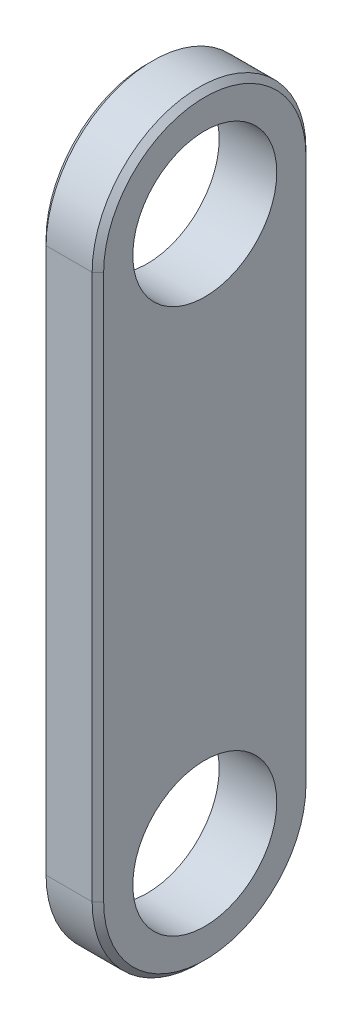
ISO-10303-21;
HEADER;
FILE_DESCRIPTION(('STEP AP214'),'2;1');
FILE_NAME('part.step','',(''),(''),'','','');
FILE_SCHEMA(('AUTOMOTIVE_DESIGN { 1 0 10303 214 1 1 1 1 }'));
ENDSEC;
DATA;
#1=APPLICATION_CONTEXT('core data for automotive mechanical design processes');
#2=APPLICATION_PROTOCOL_DEFINITION('international standard','automotive_design',2000,#1);
#3=PRODUCT_CONTEXT('',#1,'mechanical');
#4=PRODUCT('Part','Part','',(#3));
#5=PRODUCT_RELATED_PRODUCT_CATEGORY('part','',(#4));
#6=PRODUCT_DEFINITION_FORMATION('','',#4);
#7=PRODUCT_DEFINITION_CONTEXT('part definition',#1,'design');
#8=PRODUCT_DEFINITION('design','',#6,#7);
#9=PRODUCT_DEFINITION_SHAPE('','',#8);
#10=(LENGTH_UNIT() NAMED_UNIT(*) SI_UNIT(.MILLI.,.METRE.));
#11=(NAMED_UNIT(*) PLANE_ANGLE_UNIT() SI_UNIT($,.RADIAN.));
#12=(NAMED_UNIT(*) SI_UNIT($,.STERADIAN.) SOLID_ANGLE_UNIT());
#13=UNCERTAINTY_MEASURE_WITH_UNIT(LENGTH_MEASURE(1.E-05),#10,'distance_accuracy_value','');
#14=(GEOMETRIC_REPRESENTATION_CONTEXT(3) GLOBAL_UNCERTAINTY_ASSIGNED_CONTEXT((#13)) GLOBAL_UNIT_ASSIGNED_CONTEXT((#10,
#11,#12)) REPRESENTATION_CONTEXT('',''));
#15=CARTESIAN_POINT('',(0.,0.,0.));
#16=DIRECTION('',(0.,0.,1.));
#17=DIRECTION('',(1.,0.,0.));
#18=AXIS2_PLACEMENT_3D('',#15,#16,#17);
#19=CARTESIAN_POINT('',(10.,94.6778689834595,0.));
#20=DIRECTION('',(1.,0.,0.));
#21=DIRECTION('',(0.,0.,-1.));
#22=AXIS2_PLACEMENT_3D('',#19,#20,#21);
#23=PLANE('',#22);
#24=CARTESIAN_POINT('',(10.,-94.6778689834595,0.));
#25=DIRECTION('',(1.,0.,0.));
#26=DIRECTION('',(0.,0.,-1.));
#27=AXIS2_PLACEMENT_3D('',#24,#25,#26);
#28=CIRCLE('',#27,35.1285760719449);
#29=CARTESIAN_POINT('',(10.,-94.6778689834595,35.1285760719449));
#30=VERTEX_POINT('',#29);
#31=CARTESIAN_POINT('',(10.,-94.6778689834595,-35.1285760719449));
#32=VERTEX_POINT('',#31);
#33=EDGE_CURVE('E66',#30,#32,#28,.T.);
#34=ORIENTED_EDGE('',*,*,#33,.T.);
#35=DIRECTION('',(0.,1.,0.));
#36=VECTOR('',#35,1.);
#37=CARTESIAN_POINT('',(10.,94.6778689834596,-35.1285760719449));
#38=LINE('',#37,#36);
#39=CARTESIAN_POINT('',(10.,94.6778689834596,-35.1285760719449));
#40=VERTEX_POINT('',#39);
#41=EDGE_CURVE('E11',#32,#40,#38,.T.);
#42=ORIENTED_EDGE('',*,*,#41,.T.);
#43=CARTESIAN_POINT('',(10.,94.6778689834595,0.));
#44=DIRECTION('',(1.,0.,0.));
#45=DIRECTION('',(0.,0.,-1.));
#46=AXIS2_PLACEMENT_3D('',#43,#44,#45);
#47=CIRCLE('',#46,35.1285760719449);
#48=CARTESIAN_POINT('',(10.,94.6778689834595,35.1285760719449));
#49=VERTEX_POINT('',#48);
#50=EDGE_CURVE('E51',#40,#49,#47,.T.);
#51=ORIENTED_EDGE('',*,*,#50,.T.);
#52=DIRECTION('',(0.,-1.,0.));
#53=VECTOR('',#52,1.);
#54=CARTESIAN_POINT('',(10.,-94.6778689834595,35.1285760719449));
#55=LINE('',#54,#53);
#56=EDGE_CURVE('E206',#49,#30,#55,.T.);
#57=ORIENTED_EDGE('',*,*,#56,.T.);
#58=EDGE_LOOP('',(#34,#42,#51,#57));
#59=FACE_BOUND('',#58,.T.);
#60=CARTESIAN_POINT('',(10.,-94.6778689834595,0.));
#61=DIRECTION('',(1.,0.,0.));
#62=DIRECTION('',(0.,0.,-1.));
#63=AXIS2_PLACEMENT_3D('',#60,#61,#62);
#64=CIRCLE('',#63,25.);
#65=CARTESIAN_POINT('',(10.,-94.6778689834595,-25.));
#66=VERTEX_POINT('',#65);
#67=EDGE_CURVE('E134',#66,#66,#64,.T.);
#68=ORIENTED_EDGE('',*,*,#67,.F.);
#69=EDGE_LOOP('',(#68));
#70=FACE_BOUND('',#69,.T.);
#71=CARTESIAN_POINT('',(10.,94.6778689834595,0.));
#72=DIRECTION('',(1.,0.,0.));
#73=DIRECTION('',(0.,0.,-1.));
#74=AXIS2_PLACEMENT_3D('',#71,#72,#73);
#75=CIRCLE('',#74,25.);
#76=CARTESIAN_POINT('',(10.,94.6778689834595,-25.));
#77=VERTEX_POINT('',#76);
#78=EDGE_CURVE('E171',#77,#77,#75,.T.);
#79=ORIENTED_EDGE('',*,*,#78,.F.);
#80=EDGE_LOOP('',(#79));
#81=FACE_BOUND('',#80,.T.);
#82=ADVANCED_FACE('F41',(#59,#70,#81),#23,.T.);
#83=CARTESIAN_POINT('',(-10.,94.6778689834595,0.));
#84=DIRECTION('',(1.,0.,0.));
#85=DIRECTION('',(0.,0.,-1.));
#86=AXIS2_PLACEMENT_3D('',#83,#84,#85);
#87=PLANE('',#86);
#88=CARTESIAN_POINT('',(-10.,94.6778689834595,0.));
#89=DIRECTION('',(1.,0.,0.));
#90=DIRECTION('',(0.,0.,-1.));
#91=AXIS2_PLACEMENT_3D('',#88,#89,#90);
#92=CIRCLE('',#91,35.1285760719449);
#93=CARTESIAN_POINT('',(-10.,94.6778689834595,35.1285760719449));
#94=VERTEX_POINT('',#93);
#95=CARTESIAN_POINT('',(-10.,94.6778689834596,-35.1285760719448));
#96=VERTEX_POINT('',#95);
#97=EDGE_CURVE('E193',#94,#96,#92,.F.);
#98=ORIENTED_EDGE('',*,*,#97,.T.);
#99=DIRECTION('',(0.,-1.,0.));
#100=VECTOR('',#99,1.);
#101=CARTESIAN_POINT('',(-10.,94.6778689834596,-35.1285760719448));
#102=LINE('',#101,#100);
#103=CARTESIAN_POINT('',(-10.,-94.6778689834595,-35.1285760719449));
#104=VERTEX_POINT('',#103);
#105=EDGE_CURVE('E122',#96,#104,#102,.T.);
#106=ORIENTED_EDGE('',*,*,#105,.T.);
#107=CARTESIAN_POINT('',(-10.,-94.6778689834595,0.));
#108=DIRECTION('',(1.,0.,0.));
#109=DIRECTION('',(0.,0.,-1.));
#110=AXIS2_PLACEMENT_3D('',#107,#108,#109);
#111=CIRCLE('',#110,35.1285760719449);
#112=CARTESIAN_POINT('',(-10.,-94.6778689834595,35.1285760719449));
#113=VERTEX_POINT('',#112);
#114=EDGE_CURVE('E191',#104,#113,#111,.F.);
#115=ORIENTED_EDGE('',*,*,#114,.T.);
#116=DIRECTION('',(0.,1.,0.));
#117=VECTOR('',#116,1.);
#118=CARTESIAN_POINT('',(-10.,94.6778689834595,35.1285760719449));
#119=LINE('',#118,#117);
#120=EDGE_CURVE('E189',#113,#94,#119,.T.);
#121=ORIENTED_EDGE('',*,*,#120,.T.);
#122=EDGE_LOOP('',(#98,#106,#115,#121));
#123=FACE_BOUND('',#122,.T.);
#124=CARTESIAN_POINT('',(-10.,-94.6778689834595,0.));
#125=DIRECTION('',(1.,0.,0.));
#126=DIRECTION('',(0.,0.,-1.));
#127=AXIS2_PLACEMENT_3D('',#124,#125,#126);
#128=CIRCLE('',#127,25.);
#129=CARTESIAN_POINT('',(-10.,-94.6778689834595,-25.));
#130=VERTEX_POINT('',#129);
#131=EDGE_CURVE('E176',#130,#130,#128,.T.);
#132=ORIENTED_EDGE('',*,*,#131,.T.);
#133=EDGE_LOOP('',(#132));
#134=FACE_BOUND('',#133,.T.);
#135=CARTESIAN_POINT('',(-10.,94.6778689834595,0.));
#136=DIRECTION('',(1.,0.,0.));
#137=DIRECTION('',(0.,0.,-1.));
#138=AXIS2_PLACEMENT_3D('',#135,#136,#137);
#139=CIRCLE('',#138,25.);
#140=CARTESIAN_POINT('',(-10.,94.6778689834595,-25.));
#141=VERTEX_POINT('',#140);
#142=EDGE_CURVE('E165',#141,#141,#139,.T.);
#143=ORIENTED_EDGE('',*,*,#142,.T.);
#144=EDGE_LOOP('',(#143));
#145=FACE_BOUND('',#144,.T.);
#146=ADVANCED_FACE('F236',(#123,#134,#145),#87,.F.);
#147=CARTESIAN_POINT('',(10.,94.6778689834595,0.));
#148=DIRECTION('',(-1.,0.,0.));
#149=DIRECTION('',(0.,0.,1.));
#150=AXIS2_PLACEMENT_3D('',#147,#148,#149);
#151=CYLINDRICAL_SURFACE('',#150,37.1285760719449);
#152=DIRECTION('',(-1.,0.,0.));
#153=VECTOR('',#152,1.);
#154=CARTESIAN_POINT('',(10.,94.6778689834596,-37.1285760719449));
#155=LINE('',#154,#153);
#156=CARTESIAN_POINT('',(8.,94.6778689834596,-37.1285760719449));
#157=VERTEX_POINT('',#156);
#158=CARTESIAN_POINT('',(-7.99999999999997,94.6778689834596,-37.1285760719449));
#159=VERTEX_POINT('',#158);
#160=EDGE_CURVE('E115',#157,#159,#155,.T.);
#161=ORIENTED_EDGE('',*,*,#160,.T.);
#162=CARTESIAN_POINT('',(-7.99999999999997,94.6778689834595,0.));
#163=DIRECTION('',(1.,0.,0.));
#164=DIRECTION('',(0.,0.,-1.));
#165=AXIS2_PLACEMENT_3D('',#162,#163,#164);
#166=CIRCLE('',#165,37.1285760719449);
#167=CARTESIAN_POINT('',(-7.99999999999997,94.6778689834595,37.128576071945));
#168=VERTEX_POINT('',#167);
#169=EDGE_CURVE('E121',#159,#168,#166,.T.);
#170=ORIENTED_EDGE('',*,*,#169,.T.);
#171=DIRECTION('',(-1.,0.,0.));
#172=VECTOR('',#171,1.);
#173=CARTESIAN_POINT('',(10.,94.6778689834595,37.128576071945));
#174=LINE('',#173,#172);
#175=CARTESIAN_POINT('',(8.,94.6778689834595,37.128576071945));
#176=VERTEX_POINT('',#175);
#177=EDGE_CURVE('E117',#176,#168,#174,.T.);
#178=ORIENTED_EDGE('',*,*,#177,.F.);
#179=CARTESIAN_POINT('',(8.,94.6778689834595,0.));
#180=DIRECTION('',(1.,0.,0.));
#181=DIRECTION('',(0.,0.,-1.));
#182=AXIS2_PLACEMENT_3D('',#179,#180,#181);
#183=CIRCLE('',#182,37.1285760719449);
#184=EDGE_CURVE('E112',#176,#157,#183,.F.);
#185=ORIENTED_EDGE('',*,*,#184,.T.);
#186=EDGE_LOOP('',(#161,#170,#178,#185));
#187=FACE_BOUND('',#186,.T.);
#188=ADVANCED_FACE('F114',(#187),#151,.T.);
#189=CARTESIAN_POINT('',(10.,94.6778689834595,37.128576071945));
#190=DIRECTION('',(0.,0.,-1.));
#191=DIRECTION('',(0.,1.,0.));
#192=AXIS2_PLACEMENT_3D('',#189,#190,#191);
#193=PLANE('',#192);
#194=ORIENTED_EDGE('',*,*,#177,.T.);
#195=DIRECTION('',(0.,-1.,0.));
#196=VECTOR('',#195,1.);
#197=CARTESIAN_POINT('',(-7.99999999999997,94.6778689834595,37.128576071945));
#198=LINE('',#197,#196);
#199=CARTESIAN_POINT('',(-7.99999999999997,-94.6778689834595,37.1285760719449));
#200=VERTEX_POINT('',#199);
#201=EDGE_CURVE('E204',#168,#200,#198,.T.);
#202=ORIENTED_EDGE('',*,*,#201,.T.);
#203=DIRECTION('',(-1.,0.,0.));
#204=VECTOR('',#203,1.);
#205=CARTESIAN_POINT('',(10.,-94.6778689834595,37.1285760719449));
#206=LINE('',#205,#204);
#207=CARTESIAN_POINT('',(8.,-94.6778689834595,37.1285760719449));
#208=VERTEX_POINT('',#207);
#209=EDGE_CURVE('E184',#208,#200,#206,.T.);
#210=ORIENTED_EDGE('',*,*,#209,.F.);
#211=DIRECTION('',(0.,1.,0.));
#212=VECTOR('',#211,1.);
#213=CARTESIAN_POINT('',(8.,94.6778689834595,37.128576071945));
#214=LINE('',#213,#212);
#215=EDGE_CURVE('E202',#208,#176,#214,.T.);
#216=ORIENTED_EDGE('',*,*,#215,.T.);
#217=EDGE_LOOP('',(#194,#202,#210,#216));
#218=FACE_BOUND('',#217,.T.);
#219=ADVANCED_FACE('F217',(#218),#193,.F.);
#220=CARTESIAN_POINT('',(10.,-94.6778689834595,0.));
#221=DIRECTION('',(-1.,0.,0.));
#222=DIRECTION('',(0.,0.,1.));
#223=AXIS2_PLACEMENT_3D('',#220,#221,#222);
#224=CYLINDRICAL_SURFACE('',#223,37.1285760719449);
#225=ORIENTED_EDGE('',*,*,#209,.T.);
#226=CARTESIAN_POINT('',(-7.99999999999997,-94.6778689834595,0.));
#227=DIRECTION('',(1.,0.,0.));
#228=DIRECTION('',(0.,0.,-1.));
#229=AXIS2_PLACEMENT_3D('',#226,#227,#228);
#230=CIRCLE('',#229,37.1285760719449);
#231=CARTESIAN_POINT('',(-7.99999999999997,-94.6778689834595,-37.1285760719449));
#232=VERTEX_POINT('',#231);
#233=EDGE_CURVE('E200',#200,#232,#230,.T.);
#234=ORIENTED_EDGE('',*,*,#233,.T.);
#235=DIRECTION('',(-1.,0.,0.));
#236=VECTOR('',#235,1.);
#237=CARTESIAN_POINT('',(10.,-94.6778689834595,-37.1285760719449));
#238=LINE('',#237,#236);
#239=CARTESIAN_POINT('',(8.,-94.6778689834595,-37.1285760719449));
#240=VERTEX_POINT('',#239);
#241=EDGE_CURVE('E133',#240,#232,#238,.T.);
#242=ORIENTED_EDGE('',*,*,#241,.F.);
#243=CARTESIAN_POINT('',(8.,-94.6778689834595,0.));
#244=DIRECTION('',(1.,0.,0.));
#245=DIRECTION('',(0.,0.,-1.));
#246=AXIS2_PLACEMENT_3D('',#243,#244,#245);
#247=CIRCLE('',#246,37.1285760719449);
#248=EDGE_CURVE('E198',#240,#208,#247,.F.);
#249=ORIENTED_EDGE('',*,*,#248,.T.);
#250=EDGE_LOOP('',(#225,#234,#242,#249));
#251=FACE_BOUND('',#250,.T.);
#252=ADVANCED_FACE('F215',(#251),#224,.T.);
#253=CARTESIAN_POINT('',(10.,94.6778689834596,-37.1285760719449));
#254=DIRECTION('',(0.,0.,1.));
#255=DIRECTION('',(0.,-1.,0.));
#256=AXIS2_PLACEMENT_3D('',#253,#254,#255);
#257=PLANE('',#256);
#258=ORIENTED_EDGE('',*,*,#241,.T.);
#259=DIRECTION('',(0.,1.,0.));
#260=VECTOR('',#259,1.);
#261=CARTESIAN_POINT('',(-7.99999999999997,94.6778689834596,-37.1285760719449));
#262=LINE('',#261,#260);
#263=EDGE_CURVE('E132',#232,#159,#262,.T.);
#264=ORIENTED_EDGE('',*,*,#263,.T.);
#265=ORIENTED_EDGE('',*,*,#160,.F.);
#266=DIRECTION('',(0.,-1.,0.));
#267=VECTOR('',#266,1.);
#268=CARTESIAN_POINT('',(8.,-94.6778689834595,-37.1285760719449));
#269=LINE('',#268,#267);
#270=EDGE_CURVE('E129',#157,#240,#269,.T.);
#271=ORIENTED_EDGE('',*,*,#270,.T.);
#272=EDGE_LOOP('',(#258,#264,#265,#271));
#273=FACE_BOUND('',#272,.T.);
#274=ADVANCED_FACE('F128',(#273),#257,.F.);
#275=CARTESIAN_POINT('',(10.,-94.6778689834595,0.));
#276=DIRECTION('',(-1.,0.,0.));
#277=DIRECTION('',(0.,0.,1.));
#278=AXIS2_PLACEMENT_3D('',#275,#276,#277);
#279=CYLINDRICAL_SURFACE('',#278,25.);
#280=ORIENTED_EDGE('',*,*,#67,.T.);
#281=EDGE_LOOP('',(#280));
#282=FACE_BOUND('',#281,.T.);
#283=ORIENTED_EDGE('',*,*,#131,.F.);
#284=EDGE_LOOP('',(#283));
#285=FACE_BOUND('',#284,.T.);
#286=ADVANCED_FACE('F245',(#282,#285),#279,.F.);
#287=CARTESIAN_POINT('',(10.,94.6778689834595,0.));
#288=DIRECTION('',(-1.,0.,0.));
#289=DIRECTION('',(0.,0.,1.));
#290=AXIS2_PLACEMENT_3D('',#287,#288,#289);
#291=CYLINDRICAL_SURFACE('',#290,25.);
#292=ORIENTED_EDGE('',*,*,#78,.T.);
#293=EDGE_LOOP('',(#292));
#294=FACE_BOUND('',#293,.T.);
#295=ORIENTED_EDGE('',*,*,#142,.F.);
#296=EDGE_LOOP('',(#295));
#297=FACE_BOUND('',#296,.T.);
#298=ADVANCED_FACE('F281',(#294,#297),#291,.F.);
#299=CARTESIAN_POINT('',(-7.99999999999997,94.6778689834595,37.128576071945));
#300=DIRECTION('',(0.707106781186547,0.,-0.707106781186547));
#301=DIRECTION('',(0.,-1.,0.));
#302=AXIS2_PLACEMENT_3D('',#299,#300,#301);
#303=PLANE('',#302);
#304=DIRECTION('',(0.707106781186547,0.,0.707106781186547));
#305=VECTOR('',#304,1.);
#306=CARTESIAN_POINT('',(-10.,94.6778689834595,35.1285760719449));
#307=LINE('',#306,#305);
#308=EDGE_CURVE('E157',#94,#168,#307,.T.);
#309=ORIENTED_EDGE('',*,*,#308,.F.);
#310=ORIENTED_EDGE('',*,*,#120,.F.);
#311=DIRECTION('',(-0.707106781186547,0.,-0.707106781186547));
#312=VECTOR('',#311,1.);
#313=CARTESIAN_POINT('',(-7.99999999999997,-94.6778689834595,37.1285760719449));
#314=LINE('',#313,#312);
#315=EDGE_CURVE('E145',#200,#113,#314,.T.);
#316=ORIENTED_EDGE('',*,*,#315,.F.);
#317=ORIENTED_EDGE('',*,*,#201,.F.);
#318=EDGE_LOOP('',(#309,#310,#316,#317));
#319=FACE_BOUND('',#318,.T.);
#320=ADVANCED_FACE('F220',(#319),#303,.F.);
#321=CARTESIAN_POINT('',(-7.99999999999997,-94.6778689834595,0.));
#322=DIRECTION('',(1.,0.,0.));
#323=DIRECTION('',(0.,0.,-1.));
#324=AXIS2_PLACEMENT_3D('',#321,#322,#323);
#325=CONICAL_SURFACE('',#324,37.1285760719449,0.785398163397448);
#326=ORIENTED_EDGE('',*,*,#315,.T.);
#327=ORIENTED_EDGE('',*,*,#114,.F.);
#328=DIRECTION('',(-0.707106781186547,0.,0.707106781186547));
#329=VECTOR('',#328,1.);
#330=CARTESIAN_POINT('',(-7.99999999999997,-94.6778689834595,-37.1285760719449));
#331=LINE('',#330,#329);
#332=EDGE_CURVE('E151',#232,#104,#331,.T.);
#333=ORIENTED_EDGE('',*,*,#332,.F.);
#334=ORIENTED_EDGE('',*,*,#233,.F.);
#335=EDGE_LOOP('',(#326,#327,#333,#334));
#336=FACE_BOUND('',#335,.T.);
#337=ADVANCED_FACE('F223',(#336),#325,.T.);
#338=CARTESIAN_POINT('',(-7.99999999999997,94.6778689834595,0.));
#339=DIRECTION('',(1.,0.,0.));
#340=DIRECTION('',(0.,0.,-1.));
#341=AXIS2_PLACEMENT_3D('',#338,#339,#340);
#342=CONICAL_SURFACE('',#341,37.1285760719449,0.785398163397448);
#343=ORIENTED_EDGE('',*,*,#308,.T.);
#344=ORIENTED_EDGE('',*,*,#169,.F.);
#345=DIRECTION('',(0.707106781186547,0.,-0.707106781186547));
#346=VECTOR('',#345,1.);
#347=CARTESIAN_POINT('',(-10.,94.6778689834596,-35.1285760719448));
#348=LINE('',#347,#346);
#349=EDGE_CURVE('E148',#96,#159,#348,.T.);
#350=ORIENTED_EDGE('',*,*,#349,.F.);
#351=ORIENTED_EDGE('',*,*,#97,.F.);
#352=EDGE_LOOP('',(#343,#344,#350,#351));
#353=FACE_BOUND('',#352,.T.);
#354=ADVANCED_FACE('F226',(#353),#342,.T.);
#355=CARTESIAN_POINT('',(-7.99999999999997,94.6778689834596,-37.1285760719449));
#356=DIRECTION('',(0.707106781186547,0.,0.707106781186547));
#357=DIRECTION('',(0.,1.,0.));
#358=AXIS2_PLACEMENT_3D('',#355,#356,#357);
#359=PLANE('',#358);
#360=ORIENTED_EDGE('',*,*,#332,.T.);
#361=ORIENTED_EDGE('',*,*,#105,.F.);
#362=ORIENTED_EDGE('',*,*,#349,.T.);
#363=ORIENTED_EDGE('',*,*,#263,.F.);
#364=EDGE_LOOP('',(#360,#361,#362,#363));
#365=FACE_BOUND('',#364,.T.);
#366=ADVANCED_FACE('F224',(#365),#359,.F.);
#367=CARTESIAN_POINT('',(10.,94.6778689834595,35.1285760719449));
#368=DIRECTION('',(0.707106781186547,0.,0.707106781186547));
#369=DIRECTION('',(0.,1.,0.));
#370=AXIS2_PLACEMENT_3D('',#367,#368,#369);
#371=PLANE('',#370);
#372=DIRECTION('',(0.707106781186547,0.,-0.707106781186547));
#373=VECTOR('',#372,1.);
#374=CARTESIAN_POINT('',(8.,94.6778689834595,37.128576071945));
#375=LINE('',#374,#373);
#376=EDGE_CURVE('E142',#176,#49,#375,.T.);
#377=ORIENTED_EDGE('',*,*,#376,.F.);
#378=ORIENTED_EDGE('',*,*,#215,.F.);
#379=DIRECTION('',(-0.707106781186547,0.,0.707106781186547));
#380=VECTOR('',#379,1.);
#381=CARTESIAN_POINT('',(10.,-94.6778689834595,35.1285760719449));
#382=LINE('',#381,#380);
#383=EDGE_CURVE('E46',#30,#208,#382,.T.);
#384=ORIENTED_EDGE('',*,*,#383,.F.);
#385=ORIENTED_EDGE('',*,*,#56,.F.);
#386=EDGE_LOOP('',(#377,#378,#384,#385));
#387=FACE_BOUND('',#386,.T.);
#388=ADVANCED_FACE('F44',(#387),#371,.T.);
#389=CARTESIAN_POINT('',(10.,-94.6778689834595,0.));
#390=DIRECTION('',(-1.,0.,0.));
#391=DIRECTION('',(0.,0.,1.));
#392=AXIS2_PLACEMENT_3D('',#389,#390,#391);
#393=CONICAL_SURFACE('',#392,35.1285760719449,0.785398163397448);
#394=ORIENTED_EDGE('',*,*,#383,.T.);
#395=ORIENTED_EDGE('',*,*,#248,.F.);
#396=DIRECTION('',(-0.707106781186547,0.,-0.707106781186547));
#397=VECTOR('',#396,1.);
#398=CARTESIAN_POINT('',(10.,-94.6778689834595,-35.1285760719449));
#399=LINE('',#398,#397);
#400=EDGE_CURVE('E137',#32,#240,#399,.T.);
#401=ORIENTED_EDGE('',*,*,#400,.F.);
#402=ORIENTED_EDGE('',*,*,#33,.F.);
#403=EDGE_LOOP('',(#394,#395,#401,#402));
#404=FACE_BOUND('',#403,.T.);
#405=ADVANCED_FACE('F212',(#404),#393,.T.);
#406=CARTESIAN_POINT('',(10.,94.6778689834595,0.));
#407=DIRECTION('',(-1.,0.,0.));
#408=DIRECTION('',(0.,0.,1.));
#409=AXIS2_PLACEMENT_3D('',#406,#407,#408);
#410=CONICAL_SURFACE('',#409,35.1285760719449,0.785398163397448);
#411=ORIENTED_EDGE('',*,*,#376,.T.);
#412=ORIENTED_EDGE('',*,*,#50,.F.);
#413=DIRECTION('',(0.707106781186547,0.,0.707106781186547));
#414=VECTOR('',#413,1.);
#415=CARTESIAN_POINT('',(8.,94.6778689834596,-37.1285760719449));
#416=LINE('',#415,#414);
#417=EDGE_CURVE('E59',#157,#40,#416,.T.);
#418=ORIENTED_EDGE('',*,*,#417,.F.);
#419=ORIENTED_EDGE('',*,*,#184,.F.);
#420=EDGE_LOOP('',(#411,#412,#418,#419));
#421=FACE_BOUND('',#420,.T.);
#422=ADVANCED_FACE('F140',(#421),#410,.T.);
#423=CARTESIAN_POINT('',(10.,94.6778689834596,-35.1285760719449));
#424=DIRECTION('',(0.707106781186547,0.,-0.707106781186547));
#425=DIRECTION('',(0.,-1.,0.));
#426=AXIS2_PLACEMENT_3D('',#423,#424,#425);
#427=PLANE('',#426);
#428=ORIENTED_EDGE('',*,*,#400,.T.);
#429=ORIENTED_EDGE('',*,*,#270,.F.);
#430=ORIENTED_EDGE('',*,*,#417,.T.);
#431=ORIENTED_EDGE('',*,*,#41,.F.);
#432=EDGE_LOOP('',(#428,#429,#430,#431));
#433=FACE_BOUND('',#432,.T.);
#434=ADVANCED_FACE('F136',(#433),#427,.T.);
#435=CLOSED_SHELL('',(#82,#146,#188,#219,#252,#274,#286,#298,#320,#337,#354,#366,#388,#405,#422,#434));
#436=MANIFOLD_SOLID_BREP('B2',#435);
#437=ADVANCED_BREP_SHAPE_REPRESENTATION('',(#18,#436),#14);
#438=SHAPE_DEFINITION_REPRESENTATION(#9,#437);
ENDSEC;
END-ISO-10303-21;
